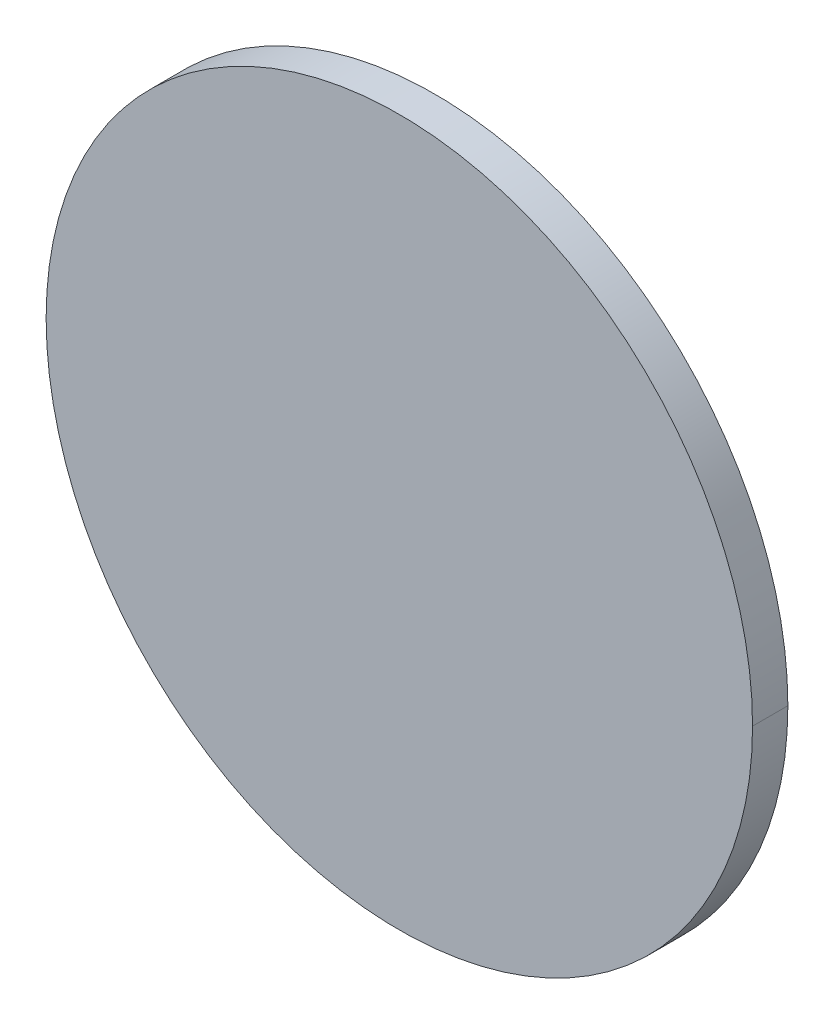
ISO-10303-21;
HEADER;
FILE_DESCRIPTION(('STEP AP214'),'2;1');
FILE_NAME('part.step','',(''),(''),'','','');
FILE_SCHEMA(('AUTOMOTIVE_DESIGN { 1 0 10303 214 1 1 1 1 }'));
ENDSEC;
DATA;
#1=APPLICATION_CONTEXT('core data for automotive mechanical design processes');
#2=APPLICATION_PROTOCOL_DEFINITION('international standard','automotive_design',2000,#1);
#3=PRODUCT_CONTEXT('',#1,'mechanical');
#4=PRODUCT('Part','Part','',(#3));
#5=PRODUCT_RELATED_PRODUCT_CATEGORY('part','',(#4));
#6=PRODUCT_DEFINITION_FORMATION('','',#4);
#7=PRODUCT_DEFINITION_CONTEXT('part definition',#1,'design');
#8=PRODUCT_DEFINITION('design','',#6,#7);
#9=PRODUCT_DEFINITION_SHAPE('','',#8);
#10=(LENGTH_UNIT() NAMED_UNIT(*) SI_UNIT(.MILLI.,.METRE.));
#11=(NAMED_UNIT(*) PLANE_ANGLE_UNIT() SI_UNIT($,.RADIAN.));
#12=(NAMED_UNIT(*) SI_UNIT($,.STERADIAN.) SOLID_ANGLE_UNIT());
#13=UNCERTAINTY_MEASURE_WITH_UNIT(LENGTH_MEASURE(1.E-05),#10,'distance_accuracy_value','');
#14=(GEOMETRIC_REPRESENTATION_CONTEXT(3) GLOBAL_UNCERTAINTY_ASSIGNED_CONTEXT((#13)) GLOBAL_UNIT_ASSIGNED_CONTEXT((#10,
#11,#12)) REPRESENTATION_CONTEXT('',''));
#15=CARTESIAN_POINT('',(0.,0.,0.));
#16=DIRECTION('',(0.,0.,1.));
#17=DIRECTION('',(1.,0.,0.));
#18=AXIS2_PLACEMENT_3D('',#15,#16,#17);
#19=CARTESIAN_POINT('',(-2.046905225095E-06,0.,0.1));
#20=DIRECTION('',(0.,0.,-1.));
#21=DIRECTION('',(0.,-1.,0.));
#22=AXIS2_PLACEMENT_3D('',#19,#20,#21);
#23=PLANE('',#22);
#24=CARTESIAN_POINT('',(-2.046905225095E-06,0.,0.1));
#25=DIRECTION('',(0.,0.,-1.));
#26=DIRECTION('',(-1.,0.,0.));
#27=AXIS2_PLACEMENT_3D('',#24,#25,#26);
#28=CIRCLE('',#27,0.999999985099);
#29=CARTESIAN_POINT('',(0.999997938194,0.,0.1));
#30=VERTEX_POINT('',#29);
#31=CARTESIAN_POINT('',(-1.000002032004,0.,0.1));
#32=VERTEX_POINT('',#31);
#33=EDGE_CURVE('E11',#30,#32,#28,.T.);
#34=ORIENTED_EDGE('',*,*,#33,.F.);
#35=CARTESIAN_POINT('',(-2.046905225095E-06,0.,0.1));
#36=DIRECTION('',(0.,0.,-1.));
#37=DIRECTION('',(-1.,0.,0.));
#38=AXIS2_PLACEMENT_3D('',#35,#36,#37);
#39=CIRCLE('',#38,0.999999985099);
#40=EDGE_CURVE('E63',#32,#30,#39,.T.);
#41=ORIENTED_EDGE('',*,*,#40,.F.);
#42=EDGE_LOOP('',(#34,#41));
#43=FACE_BOUND('',#42,.T.);
#44=ADVANCED_FACE('F17',(#43),#23,.F.);
#45=CARTESIAN_POINT('',(-2.046905225089E-06,0.,1.490116155467E-09));
#46=DIRECTION('',(0.,0.,-1.));
#47=DIRECTION('',(0.,-1.,0.));
#48=AXIS2_PLACEMENT_3D('',#45,#46,#47);
#49=PLANE('',#48);
#50=CARTESIAN_POINT('',(-2.046905225089E-06,0.,1.490116155467E-09));
#51=DIRECTION('',(0.,0.,-1.));
#52=DIRECTION('',(-1.,0.,0.));
#53=AXIS2_PLACEMENT_3D('',#50,#51,#52);
#54=CIRCLE('',#53,0.999999985099);
#55=CARTESIAN_POINT('',(0.999997938194,0.,1.490116210978E-09));
#56=VERTEX_POINT('',#55);
#57=CARTESIAN_POINT('',(-1.000002032004,0.,1.490116099956E-09));
#58=VERTEX_POINT('',#57);
#59=EDGE_CURVE('E25',#56,#58,#54,.T.);
#60=ORIENTED_EDGE('',*,*,#59,.T.);
#61=CARTESIAN_POINT('',(-2.046905225089E-06,0.,1.490116155467E-09));
#62=DIRECTION('',(0.,0.,-1.));
#63=DIRECTION('',(-1.,0.,0.));
#64=AXIS2_PLACEMENT_3D('',#61,#62,#63);
#65=CIRCLE('',#64,0.999999985099);
#66=EDGE_CURVE('E53',#58,#56,#65,.T.);
#67=ORIENTED_EDGE('',*,*,#66,.T.);
#68=EDGE_LOOP('',(#60,#67));
#69=FACE_BOUND('',#68,.T.);
#70=ADVANCED_FACE('F51',(#69),#49,.T.);
#71=CARTESIAN_POINT('',(-2.046905225089E-06,0.,1.490116155467E-09));
#72=DIRECTION('',(0.,0.,1.));
#73=DIRECTION('',(1.,0.,0.));
#74=AXIS2_PLACEMENT_3D('',#71,#72,#73);
#75=CYLINDRICAL_SURFACE('',#74,0.999999985099);
#76=DIRECTION('',(0.,0.,1.));
#77=VECTOR('',#76,1.);
#78=CARTESIAN_POINT('',(-1.000002032004,0.,1.490116099956E-09));
#79=LINE('',#78,#77);
#80=EDGE_CURVE('E58',#58,#32,#79,.T.);
#81=ORIENTED_EDGE('',*,*,#80,.F.);
#82=ORIENTED_EDGE('',*,*,#59,.F.);
#83=DIRECTION('',(0.,0.,1.));
#84=VECTOR('',#83,1.);
#85=CARTESIAN_POINT('',(0.999997938194,0.,1.490116210978E-09));
#86=LINE('',#85,#84);
#87=EDGE_CURVE('E56',#56,#30,#86,.T.);
#88=ORIENTED_EDGE('',*,*,#87,.T.);
#89=ORIENTED_EDGE('',*,*,#33,.T.);
#90=EDGE_LOOP('',(#81,#82,#88,#89));
#91=FACE_BOUND('',#90,.T.);
#92=ADVANCED_FACE('F59',(#91),#75,.T.);
#93=CARTESIAN_POINT('',(-2.046905225089E-06,0.,1.490116155467E-09));
#94=DIRECTION('',(0.,0.,1.));
#95=DIRECTION('',(1.,0.,0.));
#96=AXIS2_PLACEMENT_3D('',#93,#94,#95);
#97=CYLINDRICAL_SURFACE('',#96,0.999999985099);
#98=ORIENTED_EDGE('',*,*,#66,.F.);
#99=ORIENTED_EDGE('',*,*,#80,.T.);
#100=ORIENTED_EDGE('',*,*,#40,.T.);
#101=ORIENTED_EDGE('',*,*,#87,.F.);
#102=EDGE_LOOP('',(#98,#99,#100,#101));
#103=FACE_BOUND('',#102,.T.);
#104=ADVANCED_FACE('F65',(#103),#97,.T.);
#105=CLOSED_SHELL('',(#44,#70,#92,#104));
#106=MANIFOLD_SOLID_BREP('B1',#105);
#107=ADVANCED_BREP_SHAPE_REPRESENTATION('',(#18,#106),#14);
#108=SHAPE_DEFINITION_REPRESENTATION(#9,#107);
ENDSEC;
END-ISO-10303-21;
